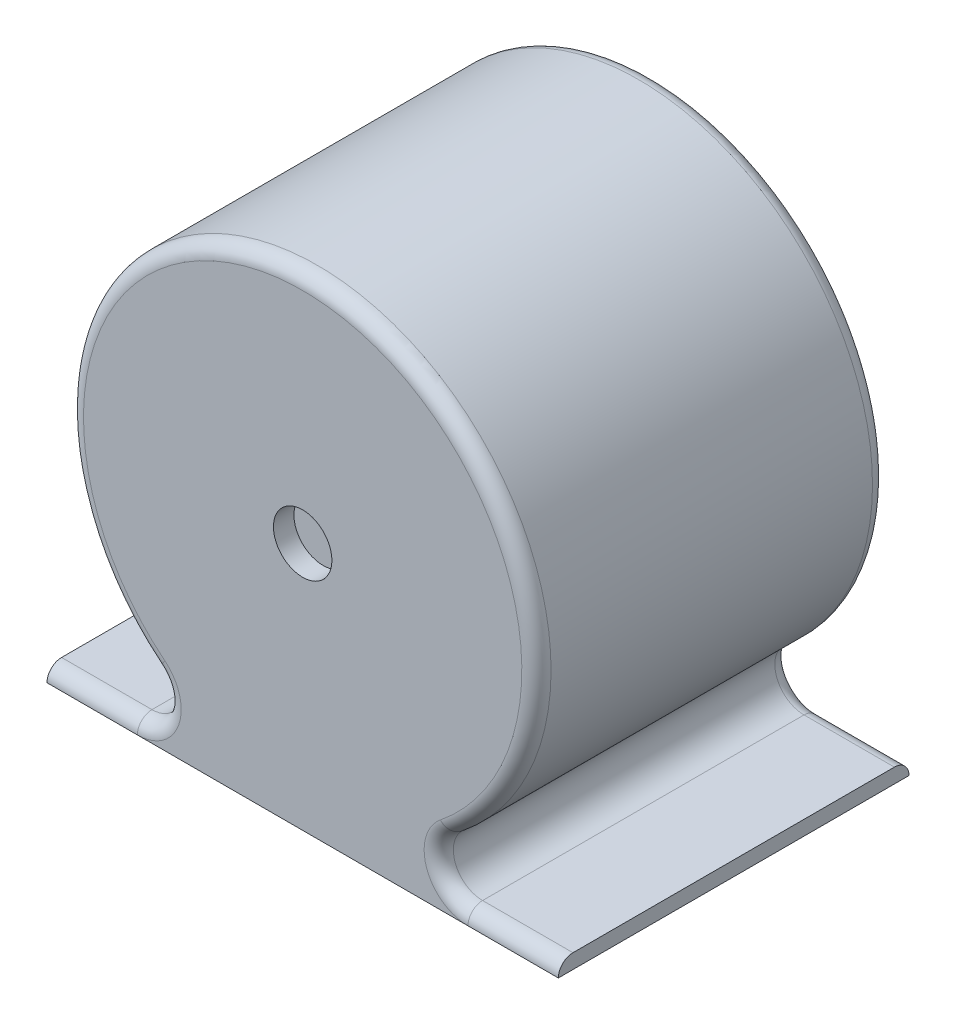
ISO-10303-21;
HEADER;
FILE_DESCRIPTION(('STEP AP214'),'2;1');
FILE_NAME('part.step','',(''),(''),'','','');
FILE_SCHEMA(('AUTOMOTIVE_DESIGN { 1 0 10303 214 1 1 1 1 }'));
ENDSEC;
DATA;
#1=APPLICATION_CONTEXT('core data for automotive mechanical design processes');
#2=APPLICATION_PROTOCOL_DEFINITION('international standard','automotive_design',2000,#1);
#3=PRODUCT_CONTEXT('',#1,'mechanical');
#4=PRODUCT('Part','Part','',(#3));
#5=PRODUCT_RELATED_PRODUCT_CATEGORY('part','',(#4));
#6=PRODUCT_DEFINITION_FORMATION('','',#4);
#7=PRODUCT_DEFINITION_CONTEXT('part definition',#1,'design');
#8=PRODUCT_DEFINITION('design','',#6,#7);
#9=PRODUCT_DEFINITION_SHAPE('','',#8);
#10=(LENGTH_UNIT() NAMED_UNIT(*) SI_UNIT(.MILLI.,.METRE.));
#11=(NAMED_UNIT(*) PLANE_ANGLE_UNIT() SI_UNIT($,.RADIAN.));
#12=(NAMED_UNIT(*) SI_UNIT($,.STERADIAN.) SOLID_ANGLE_UNIT());
#13=UNCERTAINTY_MEASURE_WITH_UNIT(LENGTH_MEASURE(1.E-05),#10,'distance_accuracy_value','');
#14=(GEOMETRIC_REPRESENTATION_CONTEXT(3) GLOBAL_UNCERTAINTY_ASSIGNED_CONTEXT((#13)) GLOBAL_UNIT_ASSIGNED_CONTEXT((#10,
#11,#12)) REPRESENTATION_CONTEXT('',''));
#15=CARTESIAN_POINT('',(0.,0.,0.));
#16=DIRECTION('',(0.,0.,1.));
#17=DIRECTION('',(1.,0.,0.));
#18=AXIS2_PLACEMENT_3D('',#15,#16,#17);
#19=CARTESIAN_POINT('',(0.,-50.8,38.1));
#20=DIRECTION('',(0.,1.,0.));
#21=DIRECTION('',(0.,0.,1.));
#22=AXIS2_PLACEMENT_3D('',#19,#20,#21);
#23=PLANE('',#22);
#24=DIRECTION('',(0.,0.,-1.));
#25=VECTOR('',#24,1.);
#26=CARTESIAN_POINT('',(35.9210244842766,-50.8,38.1));
#27=LINE('',#26,#25);
#28=CARTESIAN_POINT('',(35.9210244842766,-50.8,34.925));
#29=VERTEX_POINT('',#28);
#30=CARTESIAN_POINT('',(35.9210244842766,-50.8,-34.925));
#31=VERTEX_POINT('',#30);
#32=EDGE_CURVE('E219',#29,#31,#27,.T.);
#33=ORIENTED_EDGE('',*,*,#32,.F.);
#34=DIRECTION('',(1.,0.,0.));
#35=VECTOR('',#34,1.);
#36=CARTESIAN_POINT('',(0.,-50.8,34.925));
#37=LINE('',#36,#35);
#38=CARTESIAN_POINT('',(55.5625,-50.8,34.925));
#39=VERTEX_POINT('',#38);
#40=EDGE_CURVE('E214',#29,#39,#37,.T.);
#41=ORIENTED_EDGE('',*,*,#40,.T.);
#42=DIRECTION('',(0.,0.,-1.));
#43=VECTOR('',#42,1.);
#44=CARTESIAN_POINT('',(55.5625,-50.8,38.1));
#45=LINE('',#44,#43);
#46=CARTESIAN_POINT('',(55.5625,-50.8,-34.925));
#47=VERTEX_POINT('',#46);
#48=EDGE_CURVE('E147',#39,#47,#45,.T.);
#49=ORIENTED_EDGE('',*,*,#48,.T.);
#50=DIRECTION('',(1.,0.,0.));
#51=VECTOR('',#50,1.);
#52=CARTESIAN_POINT('',(35.9210244842766,-50.8,-34.925));
#53=LINE('',#52,#51);
#54=EDGE_CURVE('E217',#47,#31,#53,.F.);
#55=ORIENTED_EDGE('',*,*,#54,.T.);
#56=EDGE_LOOP('',(#33,#41,#49,#55));
#57=FACE_BOUND('',#56,.T.);
#58=ADVANCED_FACE('F35',(#57),#23,.T.);
#59=CARTESIAN_POINT('',(35.9210244842766,-44.45,38.1));
#60=DIRECTION('',(0.,0.,-1.));
#61=DIRECTION('',(-1.,0.,0.));
#62=AXIS2_PLACEMENT_3D('',#59,#60,#61);
#63=CYLINDRICAL_SURFACE('',#62,6.35);
#64=DIRECTION('',(0.,0.,-1.));
#65=VECTOR('',#64,1.);
#66=CARTESIAN_POINT('',(31.9297995415792,-39.5111111111111,38.1));
#67=LINE('',#66,#65);
#68=CARTESIAN_POINT('',(31.9297995415792,-39.5111111111111,34.925));
#69=VERTEX_POINT('',#68);
#70=CARTESIAN_POINT('',(31.9297995415792,-39.5111111111111,-34.925));
#71=VERTEX_POINT('',#70);
#72=EDGE_CURVE('E222',#69,#71,#67,.T.);
#73=ORIENTED_EDGE('',*,*,#72,.F.);
#74=CARTESIAN_POINT('',(35.9210244842766,-44.45,34.925));
#75=DIRECTION('',(0.,0.,1.));
#76=DIRECTION('',(1.,0.,0.));
#77=AXIS2_PLACEMENT_3D('',#74,#75,#76);
#78=CIRCLE('',#77,6.35);
#79=EDGE_CURVE('E198',#69,#29,#78,.T.);
#80=ORIENTED_EDGE('',*,*,#79,.T.);
#81=ORIENTED_EDGE('',*,*,#32,.T.);
#82=CARTESIAN_POINT('',(35.9210244842766,-44.45,-34.925));
#83=DIRECTION('',(0.,0.,1.));
#84=DIRECTION('',(1.,0.,0.));
#85=AXIS2_PLACEMENT_3D('',#82,#83,#84);
#86=CIRCLE('',#85,6.35);
#87=EDGE_CURVE('E200',#31,#71,#86,.F.);
#88=ORIENTED_EDGE('',*,*,#87,.T.);
#89=EDGE_LOOP('',(#73,#80,#81,#88));
#90=FACE_BOUND('',#89,.T.);
#91=ADVANCED_FACE('F299',(#90),#63,.F.);
#92=CARTESIAN_POINT('',(0.,0.,38.1));
#93=DIRECTION('',(0.,0.,-1.));
#94=DIRECTION('',(-1.,0.,0.));
#95=AXIS2_PLACEMENT_3D('',#92,#93,#94);
#96=CYLINDRICAL_SURFACE('',#95,50.8);
#97=DIRECTION('',(0.,0.,-1.));
#98=VECTOR('',#97,1.);
#99=CARTESIAN_POINT('',(-31.9297995415792,-39.5111111111111,38.1));
#100=LINE('',#99,#98);
#101=CARTESIAN_POINT('',(-31.9297995415792,-39.5111111111111,34.925));
#102=VERTEX_POINT('',#101);
#103=CARTESIAN_POINT('',(-31.9297995415792,-39.5111111111111,-34.925));
#104=VERTEX_POINT('',#103);
#105=EDGE_CURVE('E225',#102,#104,#100,.T.);
#106=ORIENTED_EDGE('',*,*,#105,.F.);
#107=CARTESIAN_POINT('',(0.,0.,34.925));
#108=DIRECTION('',(0.,0.,1.));
#109=DIRECTION('',(1.,0.,0.));
#110=AXIS2_PLACEMENT_3D('',#107,#108,#109);
#111=CIRCLE('',#110,50.8);
#112=EDGE_CURVE('E11',#102,#69,#111,.F.);
#113=ORIENTED_EDGE('',*,*,#112,.T.);
#114=ORIENTED_EDGE('',*,*,#72,.T.);
#115=CARTESIAN_POINT('',(0.,0.,-34.925));
#116=DIRECTION('',(0.,0.,1.));
#117=DIRECTION('',(1.,0.,0.));
#118=AXIS2_PLACEMENT_3D('',#115,#116,#117);
#119=CIRCLE('',#118,50.8);
#120=EDGE_CURVE('E44',#71,#104,#119,.T.);
#121=ORIENTED_EDGE('',*,*,#120,.T.);
#122=EDGE_LOOP('',(#106,#113,#114,#121));
#123=FACE_BOUND('',#122,.T.);
#124=ADVANCED_FACE('F288',(#123),#96,.T.);
#125=CARTESIAN_POINT('',(-35.9210244842766,-44.45,38.1));
#126=DIRECTION('',(0.,0.,-1.));
#127=DIRECTION('',(-1.,0.,0.));
#128=AXIS2_PLACEMENT_3D('',#125,#126,#127);
#129=CYLINDRICAL_SURFACE('',#128,6.35);
#130=DIRECTION('',(0.,0.,-1.));
#131=VECTOR('',#130,1.);
#132=CARTESIAN_POINT('',(-35.9210244842766,-50.8,38.1));
#133=LINE('',#132,#131);
#134=CARTESIAN_POINT('',(-35.9210244842766,-50.8,34.925));
#135=VERTEX_POINT('',#134);
#136=CARTESIAN_POINT('',(-35.9210244842766,-50.8,-34.925));
#137=VERTEX_POINT('',#136);
#138=EDGE_CURVE('E228',#135,#137,#133,.T.);
#139=ORIENTED_EDGE('',*,*,#138,.F.);
#140=CARTESIAN_POINT('',(-35.9210244842766,-44.45,34.925));
#141=DIRECTION('',(0.,0.,1.));
#142=DIRECTION('',(1.,0.,0.));
#143=AXIS2_PLACEMENT_3D('',#140,#141,#142);
#144=CIRCLE('',#143,6.35);
#145=EDGE_CURVE('E155',#135,#102,#144,.T.);
#146=ORIENTED_EDGE('',*,*,#145,.T.);
#147=ORIENTED_EDGE('',*,*,#105,.T.);
#148=CARTESIAN_POINT('',(-35.9210244842766,-44.45,-34.925));
#149=DIRECTION('',(0.,0.,1.));
#150=DIRECTION('',(1.,0.,0.));
#151=AXIS2_PLACEMENT_3D('',#148,#149,#150);
#152=CIRCLE('',#151,6.35);
#153=EDGE_CURVE('E153',#104,#137,#152,.F.);
#154=ORIENTED_EDGE('',*,*,#153,.T.);
#155=EDGE_LOOP('',(#139,#146,#147,#154));
#156=FACE_BOUND('',#155,.T.);
#157=ADVANCED_FACE('F286',(#156),#129,.F.);
#158=DIRECTION('',(0.,0.,-1.));
#159=VECTOR('',#158,1.);
#160=CARTESIAN_POINT('',(-55.5625,-50.8,38.1));
#161=LINE('',#160,#159);
#162=CARTESIAN_POINT('',(-55.5625,-50.8,34.925));
#163=VERTEX_POINT('',#162);
#164=CARTESIAN_POINT('',(-55.5625,-50.8,-34.925));
#165=VERTEX_POINT('',#164);
#166=EDGE_CURVE('E135',#163,#165,#161,.T.);
#167=ORIENTED_EDGE('',*,*,#166,.F.);
#168=DIRECTION('',(1.,0.,0.));
#169=VECTOR('',#168,1.);
#170=CARTESIAN_POINT('',(0.,-50.8,34.925));
#171=LINE('',#170,#169);
#172=EDGE_CURVE('E152',#163,#135,#171,.T.);
#173=ORIENTED_EDGE('',*,*,#172,.T.);
#174=ORIENTED_EDGE('',*,*,#138,.T.);
#175=DIRECTION('',(1.,0.,0.));
#176=VECTOR('',#175,1.);
#177=CARTESIAN_POINT('',(-55.5625,-50.8,-34.925));
#178=LINE('',#177,#176);
#179=EDGE_CURVE('E195',#137,#165,#178,.F.);
#180=ORIENTED_EDGE('',*,*,#179,.T.);
#181=EDGE_LOOP('',(#167,#173,#174,#180));
#182=FACE_BOUND('',#181,.T.);
#183=ADVANCED_FACE('F301',(#182),#23,.T.);
#184=CARTESIAN_POINT('',(-55.5625,0.,38.1));
#185=DIRECTION('',(-1.,0.,0.));
#186=DIRECTION('',(0.,0.,1.));
#187=AXIS2_PLACEMENT_3D('',#184,#185,#186);
#188=PLANE('',#187);
#189=DIRECTION('',(0.,0.,-1.));
#190=VECTOR('',#189,1.);
#191=CARTESIAN_POINT('',(-55.5625,-53.975,38.1));
#192=LINE('',#191,#190);
#193=CARTESIAN_POINT('',(-55.5625,-53.975,38.1));
#194=VERTEX_POINT('',#193);
#195=CARTESIAN_POINT('',(-55.5625,-53.975,-38.1));
#196=VERTEX_POINT('',#195);
#197=EDGE_CURVE('E123',#194,#196,#192,.T.);
#198=ORIENTED_EDGE('',*,*,#197,.F.);
#199=CARTESIAN_POINT('',(-55.5625,-53.975,34.925));
#200=DIRECTION('',(-1.,0.,0.));
#201=DIRECTION('',(0.,0.,1.));
#202=AXIS2_PLACEMENT_3D('',#199,#200,#201);
#203=CIRCLE('',#202,3.175);
#204=EDGE_CURVE('E128',#194,#163,#203,.T.);
#205=ORIENTED_EDGE('',*,*,#204,.T.);
#206=ORIENTED_EDGE('',*,*,#166,.T.);
#207=CARTESIAN_POINT('',(-55.5625,-53.975,-34.925));
#208=DIRECTION('',(-1.,0.,0.));
#209=DIRECTION('',(0.,0.,1.));
#210=AXIS2_PLACEMENT_3D('',#207,#208,#209);
#211=CIRCLE('',#210,3.175);
#212=EDGE_CURVE('E131',#165,#196,#211,.T.);
#213=ORIENTED_EDGE('',*,*,#212,.T.);
#214=EDGE_LOOP('',(#198,#205,#206,#213));
#215=FACE_BOUND('',#214,.T.);
#216=ADVANCED_FACE('F125',(#215),#188,.T.);
#217=CARTESIAN_POINT('',(0.,-53.975,38.1));
#218=DIRECTION('',(0.,1.,0.));
#219=DIRECTION('',(0.,0.,1.));
#220=AXIS2_PLACEMENT_3D('',#217,#218,#219);
#221=PLANE('',#220);
#222=DIRECTION('',(1.,0.,0.));
#223=VECTOR('',#222,1.);
#224=CARTESIAN_POINT('',(0.,-53.975,-38.1));
#225=LINE('',#224,#223);
#226=CARTESIAN_POINT('',(-35.9210244842766,-53.975,-38.1));
#227=VERTEX_POINT('',#226);
#228=EDGE_CURVE('E194',#196,#227,#225,.T.);
#229=ORIENTED_EDGE('',*,*,#228,.T.);
#230=CARTESIAN_POINT('',(35.9210244842766,-53.975,-38.1));
#231=VERTEX_POINT('',#230);
#232=EDGE_CURVE('E235',#227,#231,#225,.T.);
#233=ORIENTED_EDGE('',*,*,#232,.T.);
#234=CARTESIAN_POINT('',(55.5625,-53.975,-38.1));
#235=VERTEX_POINT('',#234);
#236=EDGE_CURVE('E236',#231,#235,#225,.T.);
#237=ORIENTED_EDGE('',*,*,#236,.T.);
#238=DIRECTION('',(0.,0.,-1.));
#239=VECTOR('',#238,1.);
#240=CARTESIAN_POINT('',(55.5625,-53.975,38.1));
#241=LINE('',#240,#239);
#242=CARTESIAN_POINT('',(55.5625,-53.975,38.1));
#243=VERTEX_POINT('',#242);
#244=EDGE_CURVE('E136',#243,#235,#241,.T.);
#245=ORIENTED_EDGE('',*,*,#244,.F.);
#246=DIRECTION('',(1.,0.,0.));
#247=VECTOR('',#246,1.);
#248=CARTESIAN_POINT('',(0.,-53.975,38.1));
#249=LINE('',#248,#247);
#250=CARTESIAN_POINT('',(35.9210244842766,-53.975,38.1));
#251=VERTEX_POINT('',#250);
#252=EDGE_CURVE('E149',#251,#243,#249,.T.);
#253=ORIENTED_EDGE('',*,*,#252,.F.);
#254=CARTESIAN_POINT('',(-35.9210244842766,-53.975,38.1));
#255=VERTEX_POINT('',#254);
#256=EDGE_CURVE('E143',#255,#251,#249,.T.);
#257=ORIENTED_EDGE('',*,*,#256,.F.);
#258=EDGE_CURVE('E140',#194,#255,#249,.T.);
#259=ORIENTED_EDGE('',*,*,#258,.F.);
#260=ORIENTED_EDGE('',*,*,#197,.T.);
#261=EDGE_LOOP('',(#229,#233,#237,#245,#253,#257,#259,#260));
#262=FACE_BOUND('',#261,.T.);
#263=ADVANCED_FACE('F141',(#262),#221,.F.);
#264=CARTESIAN_POINT('',(55.5625,0.,38.1));
#265=DIRECTION('',(1.,0.,0.));
#266=DIRECTION('',(0.,0.,-1.));
#267=AXIS2_PLACEMENT_3D('',#264,#265,#266);
#268=PLANE('',#267);
#269=ORIENTED_EDGE('',*,*,#48,.F.);
#270=CARTESIAN_POINT('',(55.5625,-53.975,34.925));
#271=DIRECTION('',(1.,0.,0.));
#272=DIRECTION('',(0.,0.,-1.));
#273=AXIS2_PLACEMENT_3D('',#270,#271,#272);
#274=CIRCLE('',#273,3.175);
#275=EDGE_CURVE('E210',#39,#243,#274,.T.);
#276=ORIENTED_EDGE('',*,*,#275,.T.);
#277=ORIENTED_EDGE('',*,*,#244,.T.);
#278=CARTESIAN_POINT('',(55.5625,-53.975,-34.925));
#279=DIRECTION('',(1.,0.,0.));
#280=DIRECTION('',(0.,0.,-1.));
#281=AXIS2_PLACEMENT_3D('',#278,#279,#280);
#282=CIRCLE('',#281,3.175);
#283=EDGE_CURVE('E212',#235,#47,#282,.T.);
#284=ORIENTED_EDGE('',*,*,#283,.T.);
#285=EDGE_LOOP('',(#269,#276,#277,#284));
#286=FACE_BOUND('',#285,.T.);
#287=ADVANCED_FACE('F258',(#286),#268,.T.);
#288=CARTESIAN_POINT('',(0.,0.,38.1));
#289=DIRECTION('',(0.,0.,1.));
#290=DIRECTION('',(1.,0.,0.));
#291=AXIS2_PLACEMENT_3D('',#288,#289,#290);
#292=PLANE('',#291);
#293=ORIENTED_EDGE('',*,*,#256,.T.);
#294=CARTESIAN_POINT('',(35.9210244842766,-44.45,38.1));
#295=DIRECTION('',(0.,0.,1.));
#296=DIRECTION('',(1.,0.,0.));
#297=AXIS2_PLACEMENT_3D('',#294,#295,#296);
#298=CIRCLE('',#297,9.525);
#299=CARTESIAN_POINT('',(29.9341870702305,-37.0416666666667,38.1));
#300=VERTEX_POINT('',#299);
#301=EDGE_CURVE('E204',#251,#300,#298,.F.);
#302=ORIENTED_EDGE('',*,*,#301,.T.);
#303=CARTESIAN_POINT('',(0.,0.,38.1));
#304=DIRECTION('',(0.,0.,1.));
#305=DIRECTION('',(1.,0.,0.));
#306=AXIS2_PLACEMENT_3D('',#303,#304,#305);
#307=CIRCLE('',#306,47.625);
#308=CARTESIAN_POINT('',(-29.9341870702305,-37.0416666666667,38.1));
#309=VERTEX_POINT('',#308);
#310=EDGE_CURVE('E208',#300,#309,#307,.T.);
#311=ORIENTED_EDGE('',*,*,#310,.T.);
#312=CARTESIAN_POINT('',(-35.9210244842766,-44.45,38.1));
#313=DIRECTION('',(0.,0.,1.));
#314=DIRECTION('',(1.,0.,0.));
#315=AXIS2_PLACEMENT_3D('',#312,#313,#314);
#316=CIRCLE('',#315,9.525);
#317=EDGE_CURVE('E206',#309,#255,#316,.F.);
#318=ORIENTED_EDGE('',*,*,#317,.T.);
#319=EDGE_LOOP('',(#293,#302,#311,#318));
#320=FACE_BOUND('',#319,.T.);
#321=CARTESIAN_POINT('',(0.,0.,38.1));
#322=DIRECTION('',(0.,0.,1.));
#323=DIRECTION('',(1.,0.,0.));
#324=AXIS2_PLACEMENT_3D('',#321,#322,#323);
#325=CIRCLE('',#324,6.35);
#326=CARTESIAN_POINT('',(6.35,0.,38.1));
#327=VERTEX_POINT('',#326);
#328=EDGE_CURVE('E177',#327,#327,#325,.T.);
#329=ORIENTED_EDGE('',*,*,#328,.F.);
#330=EDGE_LOOP('',(#329));
#331=FACE_BOUND('',#330,.T.);
#332=ADVANCED_FACE('F268',(#320,#331),#292,.T.);
#333=CARTESIAN_POINT('',(0.,0.,-38.1));
#334=DIRECTION('',(0.,0.,1.));
#335=DIRECTION('',(1.,0.,0.));
#336=AXIS2_PLACEMENT_3D('',#333,#334,#335);
#337=PLANE('',#336);
#338=CARTESIAN_POINT('',(0.,0.,-38.1));
#339=DIRECTION('',(0.,0.,1.));
#340=DIRECTION('',(1.,0.,0.));
#341=AXIS2_PLACEMENT_3D('',#338,#339,#340);
#342=CIRCLE('',#341,47.625);
#343=CARTESIAN_POINT('',(-29.9341870702305,-37.0416666666667,-38.1));
#344=VERTEX_POINT('',#343);
#345=CARTESIAN_POINT('',(29.9341870702305,-37.0416666666667,-38.1));
#346=VERTEX_POINT('',#345);
#347=EDGE_CURVE('E52',#344,#346,#342,.F.);
#348=ORIENTED_EDGE('',*,*,#347,.T.);
#349=CARTESIAN_POINT('',(35.9210244842766,-44.45,-38.1));
#350=DIRECTION('',(0.,0.,1.));
#351=DIRECTION('',(1.,0.,0.));
#352=AXIS2_PLACEMENT_3D('',#349,#350,#351);
#353=CIRCLE('',#352,9.525);
#354=EDGE_CURVE('E163',#346,#231,#353,.T.);
#355=ORIENTED_EDGE('',*,*,#354,.T.);
#356=ORIENTED_EDGE('',*,*,#232,.F.);
#357=CARTESIAN_POINT('',(-35.9210244842766,-44.45,-38.1));
#358=DIRECTION('',(0.,0.,1.));
#359=DIRECTION('',(1.,0.,0.));
#360=AXIS2_PLACEMENT_3D('',#357,#358,#359);
#361=CIRCLE('',#360,9.525);
#362=EDGE_CURVE('E57',#227,#344,#361,.T.);
#363=ORIENTED_EDGE('',*,*,#362,.T.);
#364=EDGE_LOOP('',(#348,#355,#356,#363));
#365=FACE_BOUND('',#364,.T.);
#366=ADVANCED_FACE('F391',(#365),#337,.F.);
#367=CARTESIAN_POINT('',(0.,0.,33.655));
#368=DIRECTION('',(0.,0.,1.));
#369=DIRECTION('',(1.,0.,0.));
#370=AXIS2_PLACEMENT_3D('',#367,#368,#369);
#371=CYLINDRICAL_SURFACE('',#370,6.35);
#372=CARTESIAN_POINT('',(0.,0.,33.655));
#373=DIRECTION('',(0.,0.,1.));
#374=DIRECTION('',(1.,0.,0.));
#375=AXIS2_PLACEMENT_3D('',#372,#373,#374);
#376=CIRCLE('',#375,6.35);
#377=CARTESIAN_POINT('',(6.35,0.,33.655));
#378=VERTEX_POINT('',#377);
#379=EDGE_CURVE('E240',#378,#378,#376,.T.);
#380=ORIENTED_EDGE('',*,*,#379,.F.);
#381=EDGE_LOOP('',(#380));
#382=FACE_BOUND('',#381,.T.);
#383=ORIENTED_EDGE('',*,*,#328,.T.);
#384=EDGE_LOOP('',(#383));
#385=FACE_BOUND('',#384,.T.);
#386=ADVANCED_FACE('F396',(#382,#385),#371,.F.);
#387=CARTESIAN_POINT('',(0.,0.,33.655));
#388=DIRECTION('',(0.,0.,1.));
#389=DIRECTION('',(1.,0.,0.));
#390=AXIS2_PLACEMENT_3D('',#387,#388,#389);
#391=PLANE('',#390);
#392=ORIENTED_EDGE('',*,*,#379,.T.);
#393=EDGE_LOOP('',(#392));
#394=FACE_BOUND('',#393,.T.);
#395=ADVANCED_FACE('F329',(#394),#391,.T.);
#396=CARTESIAN_POINT('',(0.,-53.975,34.925));
#397=DIRECTION('',(1.,0.,0.));
#398=DIRECTION('',(0.,0.,-1.));
#399=AXIS2_PLACEMENT_3D('',#396,#397,#398);
#400=CYLINDRICAL_SURFACE('',#399,3.175);
#401=ORIENTED_EDGE('',*,*,#204,.F.);
#402=ORIENTED_EDGE('',*,*,#258,.T.);
#403=CARTESIAN_POINT('',(-35.9210244842766,-53.975,34.925));
#404=DIRECTION('',(1.,0.,0.));
#405=DIRECTION('',(0.,0.,-1.));
#406=AXIS2_PLACEMENT_3D('',#403,#404,#405);
#407=CIRCLE('',#406,3.175);
#408=EDGE_CURVE('E175',#135,#255,#407,.T.);
#409=ORIENTED_EDGE('',*,*,#408,.F.);
#410=ORIENTED_EDGE('',*,*,#172,.F.);
#411=EDGE_LOOP('',(#401,#402,#409,#410));
#412=FACE_BOUND('',#411,.T.);
#413=ADVANCED_FACE('F151',(#412),#400,.T.);
#414=CARTESIAN_POINT('',(-35.9210244842766,-44.45,34.925));
#415=DIRECTION('',(0.,0.,1.));
#416=DIRECTION('',(1.,0.,0.));
#417=AXIS2_PLACEMENT_3D('',#414,#415,#416);
#418=TOROIDAL_SURFACE('',#417,9.525,3.175);
#419=ORIENTED_EDGE('',*,*,#408,.T.);
#420=ORIENTED_EDGE('',*,*,#317,.F.);
#421=CARTESIAN_POINT('',(-29.9341870702305,-37.0416666666667,34.925));
#422=DIRECTION('',(-0.777777777777778,0.628539361054708,0.));
#423=DIRECTION('',(-0.628539361054708,-0.777777777777778,0.));
#424=AXIS2_PLACEMENT_3D('',#421,#422,#423);
#425=CIRCLE('',#424,3.175);
#426=EDGE_CURVE('E172',#102,#309,#425,.T.);
#427=ORIENTED_EDGE('',*,*,#426,.F.);
#428=ORIENTED_EDGE('',*,*,#145,.F.);
#429=EDGE_LOOP('',(#419,#420,#427,#428));
#430=FACE_BOUND('',#429,.T.);
#431=ADVANCED_FACE('F281',(#430),#418,.T.);
#432=CARTESIAN_POINT('',(0.,0.,34.925));
#433=DIRECTION('',(0.,0.,1.));
#434=DIRECTION('',(1.,0.,0.));
#435=AXIS2_PLACEMENT_3D('',#432,#433,#434);
#436=TOROIDAL_SURFACE('',#435,47.625,3.175);
#437=ORIENTED_EDGE('',*,*,#426,.T.);
#438=ORIENTED_EDGE('',*,*,#310,.F.);
#439=CARTESIAN_POINT('',(29.9341870702305,-37.0416666666667,34.925));
#440=DIRECTION('',(-0.777777777777777,-0.628539361054709,0.));
#441=DIRECTION('',(0.628539361054709,-0.777777777777777,0.));
#442=AXIS2_PLACEMENT_3D('',#439,#440,#441);
#443=CIRCLE('',#442,3.175);
#444=EDGE_CURVE('E169',#69,#300,#443,.T.);
#445=ORIENTED_EDGE('',*,*,#444,.F.);
#446=ORIENTED_EDGE('',*,*,#112,.F.);
#447=EDGE_LOOP('',(#437,#438,#445,#446));
#448=FACE_BOUND('',#447,.T.);
#449=ADVANCED_FACE('F278',(#448),#436,.T.);
#450=CARTESIAN_POINT('',(35.9210244842766,-44.45,34.925));
#451=DIRECTION('',(0.,0.,1.));
#452=DIRECTION('',(1.,0.,0.));
#453=AXIS2_PLACEMENT_3D('',#450,#451,#452);
#454=TOROIDAL_SURFACE('',#453,9.525,3.175);
#455=ORIENTED_EDGE('',*,*,#444,.T.);
#456=ORIENTED_EDGE('',*,*,#301,.F.);
#457=CARTESIAN_POINT('',(35.9210244842766,-53.975,34.925));
#458=DIRECTION('',(1.,0.,0.));
#459=DIRECTION('',(0.,0.,-1.));
#460=AXIS2_PLACEMENT_3D('',#457,#458,#459);
#461=CIRCLE('',#460,3.175);
#462=EDGE_CURVE('E166',#29,#251,#461,.T.);
#463=ORIENTED_EDGE('',*,*,#462,.F.);
#464=ORIENTED_EDGE('',*,*,#79,.F.);
#465=EDGE_LOOP('',(#455,#456,#463,#464));
#466=FACE_BOUND('',#465,.T.);
#467=ADVANCED_FACE('F273',(#466),#454,.T.);
#468=CARTESIAN_POINT('',(0.,-53.975,34.925));
#469=DIRECTION('',(1.,0.,0.));
#470=DIRECTION('',(0.,0.,-1.));
#471=AXIS2_PLACEMENT_3D('',#468,#469,#470);
#472=CYLINDRICAL_SURFACE('',#471,3.175);
#473=ORIENTED_EDGE('',*,*,#462,.T.);
#474=ORIENTED_EDGE('',*,*,#252,.T.);
#475=ORIENTED_EDGE('',*,*,#275,.F.);
#476=ORIENTED_EDGE('',*,*,#40,.F.);
#477=EDGE_LOOP('',(#473,#474,#475,#476));
#478=FACE_BOUND('',#477,.T.);
#479=ADVANCED_FACE('F264',(#478),#472,.T.);
#480=CARTESIAN_POINT('',(0.,-53.975,-34.925));
#481=DIRECTION('',(-1.,0.,0.));
#482=DIRECTION('',(0.,0.,1.));
#483=AXIS2_PLACEMENT_3D('',#480,#481,#482);
#484=CYLINDRICAL_SURFACE('',#483,3.175);
#485=ORIENTED_EDGE('',*,*,#212,.F.);
#486=ORIENTED_EDGE('',*,*,#179,.F.);
#487=CARTESIAN_POINT('',(-35.9210244842766,-53.975,-34.925));
#488=DIRECTION('',(1.,0.,0.));
#489=DIRECTION('',(0.,0.,-1.));
#490=AXIS2_PLACEMENT_3D('',#487,#488,#489);
#491=CIRCLE('',#490,3.175);
#492=EDGE_CURVE('E39',#227,#137,#491,.T.);
#493=ORIENTED_EDGE('',*,*,#492,.F.);
#494=ORIENTED_EDGE('',*,*,#228,.F.);
#495=EDGE_LOOP('',(#485,#486,#493,#494));
#496=FACE_BOUND('',#495,.T.);
#497=ADVANCED_FACE('F37',(#496),#484,.T.);
#498=CARTESIAN_POINT('',(-35.9210244842766,-44.45,-34.925));
#499=DIRECTION('',(0.,0.,1.));
#500=DIRECTION('',(1.,0.,0.));
#501=AXIS2_PLACEMENT_3D('',#498,#499,#500);
#502=TOROIDAL_SURFACE('',#501,9.525,3.175);
#503=ORIENTED_EDGE('',*,*,#492,.T.);
#504=ORIENTED_EDGE('',*,*,#153,.F.);
#505=CARTESIAN_POINT('',(-29.9341870702305,-37.0416666666667,-34.925));
#506=DIRECTION('',(-0.777777777777778,0.628539361054709,0.));
#507=DIRECTION('',(-0.628539361054709,-0.777777777777778,0.));
#508=AXIS2_PLACEMENT_3D('',#505,#506,#507);
#509=CIRCLE('',#508,3.175);
#510=EDGE_CURVE('E183',#344,#104,#509,.T.);
#511=ORIENTED_EDGE('',*,*,#510,.F.);
#512=ORIENTED_EDGE('',*,*,#362,.F.);
#513=EDGE_LOOP('',(#503,#504,#511,#512));
#514=FACE_BOUND('',#513,.T.);
#515=ADVANCED_FACE('F191',(#514),#502,.T.);
#516=CARTESIAN_POINT('',(0.,0.,-34.925));
#517=DIRECTION('',(0.,0.,1.));
#518=DIRECTION('',(1.,0.,0.));
#519=AXIS2_PLACEMENT_3D('',#516,#517,#518);
#520=TOROIDAL_SURFACE('',#519,47.625,3.175);
#521=ORIENTED_EDGE('',*,*,#510,.T.);
#522=ORIENTED_EDGE('',*,*,#120,.F.);
#523=CARTESIAN_POINT('',(29.9341870702305,-37.0416666666667,-34.925));
#524=DIRECTION('',(-0.777777777777778,-0.628539361054708,0.));
#525=DIRECTION('',(0.628539361054708,-0.777777777777779,0.));
#526=AXIS2_PLACEMENT_3D('',#523,#524,#525);
#527=CIRCLE('',#526,3.175);
#528=EDGE_CURVE('E181',#346,#71,#527,.T.);
#529=ORIENTED_EDGE('',*,*,#528,.F.);
#530=ORIENTED_EDGE('',*,*,#347,.F.);
#531=EDGE_LOOP('',(#521,#522,#529,#530));
#532=FACE_BOUND('',#531,.T.);
#533=ADVANCED_FACE('F290',(#532),#520,.T.);
#534=CARTESIAN_POINT('',(35.9210244842766,-44.45,-34.925));
#535=DIRECTION('',(0.,0.,1.));
#536=DIRECTION('',(1.,0.,0.));
#537=AXIS2_PLACEMENT_3D('',#534,#535,#536);
#538=TOROIDAL_SURFACE('',#537,9.525,3.175);
#539=ORIENTED_EDGE('',*,*,#528,.T.);
#540=ORIENTED_EDGE('',*,*,#87,.F.);
#541=CARTESIAN_POINT('',(35.9210244842766,-53.975,-34.925));
#542=DIRECTION('',(1.,0.,0.));
#543=DIRECTION('',(0.,0.,-1.));
#544=AXIS2_PLACEMENT_3D('',#541,#542,#543);
#545=CIRCLE('',#544,3.175);
#546=EDGE_CURVE('E178',#231,#31,#545,.T.);
#547=ORIENTED_EDGE('',*,*,#546,.F.);
#548=ORIENTED_EDGE('',*,*,#354,.F.);
#549=EDGE_LOOP('',(#539,#540,#547,#548));
#550=FACE_BOUND('',#549,.T.);
#551=ADVANCED_FACE('F252',(#550),#538,.T.);
#552=CARTESIAN_POINT('',(0.,-53.975,-34.925));
#553=DIRECTION('',(-1.,0.,0.));
#554=DIRECTION('',(0.,0.,1.));
#555=AXIS2_PLACEMENT_3D('',#552,#553,#554);
#556=CYLINDRICAL_SURFACE('',#555,3.175);
#557=ORIENTED_EDGE('',*,*,#546,.T.);
#558=ORIENTED_EDGE('',*,*,#54,.F.);
#559=ORIENTED_EDGE('',*,*,#283,.F.);
#560=ORIENTED_EDGE('',*,*,#236,.F.);
#561=EDGE_LOOP('',(#557,#558,#559,#560));
#562=FACE_BOUND('',#561,.T.);
#563=ADVANCED_FACE('F255',(#562),#556,.T.);
#564=CLOSED_SHELL('',(#58,#91,#124,#157,#183,#216,#263,#287,#332,#366,#386,#395,#413,#431,#449,
#467,#479,#497,#515,#533,#551,#563));
#565=MANIFOLD_SOLID_BREP('B2',#564);
#566=ADVANCED_BREP_SHAPE_REPRESENTATION('',(#18,#565),#14);
#567=SHAPE_DEFINITION_REPRESENTATION(#9,#566);
ENDSEC;
END-ISO-10303-21;
